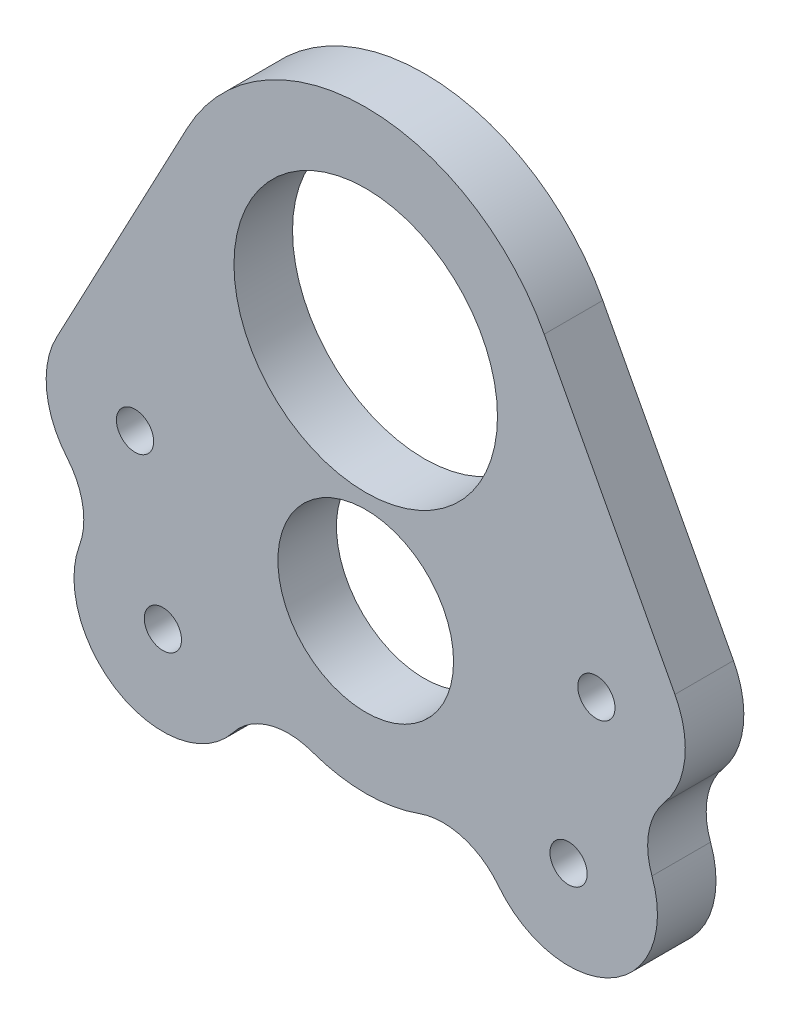
ISO-10303-21;
HEADER;
FILE_DESCRIPTION(('STEP AP214'),'2;1');
FILE_NAME('part.step','',(''),(''),'','','');
FILE_SCHEMA(('AUTOMOTIVE_DESIGN { 1 0 10303 214 1 1 1 1 }'));
ENDSEC;
DATA;
#1=APPLICATION_CONTEXT('core data for automotive mechanical design processes');
#2=APPLICATION_PROTOCOL_DEFINITION('international standard','automotive_design',2000,#1);
#3=PRODUCT_CONTEXT('',#1,'mechanical');
#4=PRODUCT('Part','Part','',(#3));
#5=PRODUCT_RELATED_PRODUCT_CATEGORY('part','',(#4));
#6=PRODUCT_DEFINITION_FORMATION('','',#4);
#7=PRODUCT_DEFINITION_CONTEXT('part definition',#1,'design');
#8=PRODUCT_DEFINITION('design','',#6,#7);
#9=PRODUCT_DEFINITION_SHAPE('','',#8);
#10=(LENGTH_UNIT() NAMED_UNIT(*) SI_UNIT(.MILLI.,.METRE.));
#11=(NAMED_UNIT(*) PLANE_ANGLE_UNIT() SI_UNIT($,.RADIAN.));
#12=(NAMED_UNIT(*) SI_UNIT($,.STERADIAN.) SOLID_ANGLE_UNIT());
#13=UNCERTAINTY_MEASURE_WITH_UNIT(LENGTH_MEASURE(1.E-05),#10,'distance_accuracy_value','');
#14=(GEOMETRIC_REPRESENTATION_CONTEXT(3) GLOBAL_UNCERTAINTY_ASSIGNED_CONTEXT((#13)) GLOBAL_UNIT_ASSIGNED_CONTEXT((#10,
#11,#12)) REPRESENTATION_CONTEXT('',''));
#15=CARTESIAN_POINT('',(0.,0.,0.));
#16=DIRECTION('',(0.,0.,1.));
#17=DIRECTION('',(1.,0.,0.));
#18=AXIS2_PLACEMENT_3D('',#15,#16,#17);
#19=CARTESIAN_POINT('',(25.0141169265101,4.41066371274003,6.35));
#20=DIRECTION('',(0.,0.,1.));
#21=DIRECTION('',(1.,0.,0.));
#22=AXIS2_PLACEMENT_3D('',#19,#20,#21);
#23=PLANE('',#22);
#24=CARTESIAN_POINT('',(-21.9970452561247,-12.7,6.35));
#25=DIRECTION('',(0.,0.,1.));
#26=DIRECTION('',(1.,0.,0.));
#27=AXIS2_PLACEMENT_3D('',#24,#25,#26);
#28=CIRCLE('',#27,2.0193);
#29=CARTESIAN_POINT('',(-19.9777452561247,-12.7,6.35));
#30=VERTEX_POINT('',#29);
#31=EDGE_CURVE('E298',#30,#30,#28,.T.);
#32=ORIENTED_EDGE('',*,*,#31,.F.);
#33=EDGE_LOOP('',(#32));
#34=FACE_BOUND('',#33,.T.);
#35=CARTESIAN_POINT('',(25.0141169265101,4.41066371274003,6.35));
#36=DIRECTION('',(0.,0.,1.));
#37=DIRECTION('',(1.,0.,0.));
#38=AXIS2_PLACEMENT_3D('',#35,#36,#37);
#39=CIRCLE('',#38,2.0193);
#40=CARTESIAN_POINT('',(27.0334169265101,4.41066371274003,6.35));
#41=VERTEX_POINT('',#40);
#42=EDGE_CURVE('E310',#41,#41,#39,.T.);
#43=ORIENTED_EDGE('',*,*,#42,.F.);
#44=EDGE_LOOP('',(#43));
#45=FACE_BOUND('',#44,.T.);
#46=CARTESIAN_POINT('',(0.,25.4,6.35));
#47=DIRECTION('',(0.,0.,1.));
#48=DIRECTION('',(1.,0.,0.));
#49=AXIS2_PLACEMENT_3D('',#46,#47,#48);
#50=CIRCLE('',#49,14.2875);
#51=CARTESIAN_POINT('',(14.2875,25.4,6.35));
#52=VERTEX_POINT('',#51);
#53=EDGE_CURVE('E157',#52,#52,#50,.T.);
#54=ORIENTED_EDGE('',*,*,#53,.F.);
#55=EDGE_LOOP('',(#54));
#56=FACE_BOUND('',#55,.T.);
#57=CARTESIAN_POINT('',(25.0141169265101,4.41066371274003,6.35));
#58=DIRECTION('',(0.,0.,1.));
#59=DIRECTION('',(1.,0.,0.));
#60=AXIS2_PLACEMENT_3D('',#57,#58,#59);
#61=CIRCLE('',#60,9.6393);
#62=CARTESIAN_POINT('',(32.3742647228758,-1.81383055632732,6.35));
#63=VERTEX_POINT('',#62);
#64=CARTESIAN_POINT('',(33.5304812704021,8.92593146250688,6.35));
#65=VERTEX_POINT('',#64);
#66=EDGE_CURVE('E176',#63,#65,#61,.T.);
#67=ORIENTED_EDGE('',*,*,#66,.T.);
#68=DIRECTION('',(-0.468422784825336,0.883504439522789,0.));
#69=VECTOR('',#68,1.);
#70=CARTESIAN_POINT('',(33.5304812704021,8.92593146250688,6.35));
#71=LINE('',#70,#69);
#72=CARTESIAN_POINT('',(19.3553735088455,35.6619721585611,6.35));
#73=VERTEX_POINT('',#72);
#74=EDGE_CURVE('E104',#65,#73,#71,.T.);
#75=ORIENTED_EDGE('',*,*,#74,.T.);
#76=CARTESIAN_POINT('',(0.,25.4,6.35));
#77=DIRECTION('',(0.,0.,1.));
#78=DIRECTION('',(1.,0.,0.));
#79=AXIS2_PLACEMENT_3D('',#76,#77,#78);
#80=CIRCLE('',#79,21.9075);
#81=CARTESIAN_POINT('',(-19.3553735088455,35.6619721585611,6.35));
#82=VERTEX_POINT('',#81);
#83=EDGE_CURVE('E203',#73,#82,#80,.T.);
#84=ORIENTED_EDGE('',*,*,#83,.T.);
#85=DIRECTION('',(-0.468422784825336,-0.883504439522789,0.));
#86=VECTOR('',#85,1.);
#87=CARTESIAN_POINT('',(-33.5304812704021,8.92593146250688,6.35));
#88=LINE('',#87,#86);
#89=CARTESIAN_POINT('',(-33.5304812704021,8.92593146250688,6.35));
#90=VERTEX_POINT('',#89);
#91=EDGE_CURVE('E222',#82,#90,#88,.T.);
#92=ORIENTED_EDGE('',*,*,#91,.T.);
#93=CARTESIAN_POINT('',(-25.0141169265101,4.41066371274002,6.35));
#94=DIRECTION('',(0.,0.,1.));
#95=DIRECTION('',(1.,0.,0.));
#96=AXIS2_PLACEMENT_3D('',#93,#94,#95);
#97=CIRCLE('',#96,9.63930000000001);
#98=CARTESIAN_POINT('',(-32.3742647228758,-1.81383055632735,6.35));
#99=VERTEX_POINT('',#98);
#100=EDGE_CURVE('E219',#90,#99,#97,.T.);
#101=ORIENTED_EDGE('',*,*,#100,.T.);
#102=CARTESIAN_POINT('',(-38.1925633761294,-6.73437938562962,6.35));
#103=DIRECTION('',(0.,0.,-1.));
#104=DIRECTION('',(1.,0.,0.));
#105=AXIS2_PLACEMENT_3D('',#102,#103,#104);
#106=CIRCLE('',#105,7.62);
#107=CARTESIAN_POINT('',(-31.0422242502995,-9.36820747144436,6.35));
#108=VERTEX_POINT('',#107);
#109=EDGE_CURVE('E221',#99,#108,#106,.T.);
#110=ORIENTED_EDGE('',*,*,#109,.T.);
#111=CARTESIAN_POINT('',(-21.9970452561247,-12.7,6.35));
#112=DIRECTION('',(0.,0.,1.));
#113=DIRECTION('',(1.,0.,0.));
#114=AXIS2_PLACEMENT_3D('',#111,#112,#113);
#115=CIRCLE('',#114,9.63930000000001);
#116=CARTESIAN_POINT('',(-14.3917371610649,-18.6224482496024,6.35));
#117=VERTEX_POINT('',#116);
#118=EDGE_CURVE('E224',#108,#117,#115,.T.);
#119=ORIENTED_EDGE('',*,*,#118,.T.);
#120=CARTESIAN_POINT('',(-8.37963590014811,-23.3042255220153,6.35));
#121=DIRECTION('',(0.,0.,-1.));
#122=DIRECTION('',(-1.,0.,0.));
#123=AXIS2_PLACEMENT_3D('',#120,#121,#122);
#124=CIRCLE('',#123,7.62);
#125=CARTESIAN_POINT('',(-5.80128639241023,-16.1336945921644,6.35));
#126=VERTEX_POINT('',#125);
#127=EDGE_CURVE('E230',#117,#126,#124,.T.);
#128=ORIENTED_EDGE('',*,*,#127,.T.);
#129=CARTESIAN_POINT('',(0.,0.,6.35));
#130=DIRECTION('',(0.,0.,1.));
#131=DIRECTION('',(1.,0.,0.));
#132=AXIS2_PLACEMENT_3D('',#129,#130,#131);
#133=CIRCLE('',#132,17.145);
#134=CARTESIAN_POINT('',(5.80128639241024,-16.1336945921644,6.35));
#135=VERTEX_POINT('',#134);
#136=EDGE_CURVE('E135',#126,#135,#133,.T.);
#137=ORIENTED_EDGE('',*,*,#136,.T.);
#138=CARTESIAN_POINT('',(8.37963590014812,-23.3042255220153,6.35));
#139=DIRECTION('',(0.,0.,-1.));
#140=DIRECTION('',(1.,0.,0.));
#141=AXIS2_PLACEMENT_3D('',#138,#139,#140);
#142=CIRCLE('',#141,7.62);
#143=CARTESIAN_POINT('',(14.391737161065,-18.6224482496023,6.35));
#144=VERTEX_POINT('',#143);
#145=EDGE_CURVE('E129',#135,#144,#142,.T.);
#146=ORIENTED_EDGE('',*,*,#145,.T.);
#147=CARTESIAN_POINT('',(21.9970452561247,-12.7,6.35));
#148=DIRECTION('',(0.,0.,1.));
#149=DIRECTION('',(1.,0.,0.));
#150=AXIS2_PLACEMENT_3D('',#147,#148,#149);
#151=CIRCLE('',#150,9.6393);
#152=CARTESIAN_POINT('',(31.0422242502995,-9.36820747144433,6.35));
#153=VERTEX_POINT('',#152);
#154=EDGE_CURVE('E133',#144,#153,#151,.T.);
#155=ORIENTED_EDGE('',*,*,#154,.T.);
#156=CARTESIAN_POINT('',(38.1925633761294,-6.73437938562958,6.35));
#157=DIRECTION('',(0.,0.,-1.));
#158=DIRECTION('',(1.,0.,0.));
#159=AXIS2_PLACEMENT_3D('',#156,#157,#158);
#160=CIRCLE('',#159,7.62);
#161=EDGE_CURVE('E49',#153,#63,#160,.T.);
#162=ORIENTED_EDGE('',*,*,#161,.T.);
#163=EDGE_LOOP('',(#67,#75,#84,#92,#101,#110,#119,#128,#137,#146,#155,#162));
#164=FACE_BOUND('',#163,.T.);
#165=CARTESIAN_POINT('',(0.,0.,6.35));
#166=DIRECTION('',(0.,0.,1.));
#167=DIRECTION('',(1.,0.,0.));
#168=AXIS2_PLACEMENT_3D('',#165,#166,#167);
#169=CIRCLE('',#168,9.525);
#170=CARTESIAN_POINT('',(9.525,0.,6.35));
#171=VERTEX_POINT('',#170);
#172=EDGE_CURVE('E316',#171,#171,#169,.T.);
#173=ORIENTED_EDGE('',*,*,#172,.F.);
#174=EDGE_LOOP('',(#173));
#175=FACE_BOUND('',#174,.T.);
#176=CARTESIAN_POINT('',(21.9970452561247,-12.7,6.35));
#177=DIRECTION('',(0.,0.,1.));
#178=DIRECTION('',(1.,0.,0.));
#179=AXIS2_PLACEMENT_3D('',#176,#177,#178);
#180=CIRCLE('',#179,2.0193);
#181=CARTESIAN_POINT('',(24.0163452561247,-12.7,6.35));
#182=VERTEX_POINT('',#181);
#183=EDGE_CURVE('E304',#182,#182,#180,.T.);
#184=ORIENTED_EDGE('',*,*,#183,.F.);
#185=EDGE_LOOP('',(#184));
#186=FACE_BOUND('',#185,.T.);
#187=CARTESIAN_POINT('',(-25.0141169265101,4.41066371274002,6.35));
#188=DIRECTION('',(0.,0.,1.));
#189=DIRECTION('',(1.,0.,0.));
#190=AXIS2_PLACEMENT_3D('',#187,#188,#189);
#191=CIRCLE('',#190,2.0193);
#192=CARTESIAN_POINT('',(-22.9948169265101,4.41066371274002,6.35));
#193=VERTEX_POINT('',#192);
#194=EDGE_CURVE('E289',#193,#193,#191,.T.);
#195=ORIENTED_EDGE('',*,*,#194,.F.);
#196=EDGE_LOOP('',(#195));
#197=FACE_BOUND('',#196,.T.);
#198=ADVANCED_FACE('F32',(#34,#45,#56,#164,#175,#186,#197),#23,.T.);
#199=CARTESIAN_POINT('',(25.0141169265101,4.41066371274003,0.));
#200=DIRECTION('',(0.,0.,1.));
#201=DIRECTION('',(1.,0.,0.));
#202=AXIS2_PLACEMENT_3D('',#199,#200,#201);
#203=PLANE('',#202);
#204=CARTESIAN_POINT('',(25.0141169265101,4.41066371274003,0.));
#205=DIRECTION('',(0.,0.,1.));
#206=DIRECTION('',(1.,0.,0.));
#207=AXIS2_PLACEMENT_3D('',#204,#205,#206);
#208=CIRCLE('',#207,9.6393);
#209=CARTESIAN_POINT('',(32.3742647228758,-1.81383055632732,0.));
#210=VERTEX_POINT('',#209);
#211=CARTESIAN_POINT('',(33.5304812704021,8.92593146250688,0.));
#212=VERTEX_POINT('',#211);
#213=EDGE_CURVE('E153',#210,#212,#208,.T.);
#214=ORIENTED_EDGE('',*,*,#213,.F.);
#215=CARTESIAN_POINT('',(38.1925633761294,-6.73437938562958,0.));
#216=DIRECTION('',(0.,0.,-1.));
#217=DIRECTION('',(1.,0.,0.));
#218=AXIS2_PLACEMENT_3D('',#215,#216,#217);
#219=CIRCLE('',#218,7.62);
#220=CARTESIAN_POINT('',(31.0422242502995,-9.36820747144433,0.));
#221=VERTEX_POINT('',#220);
#222=EDGE_CURVE('E96',#221,#210,#219,.T.);
#223=ORIENTED_EDGE('',*,*,#222,.F.);
#224=CARTESIAN_POINT('',(21.9970452561247,-12.7,0.));
#225=DIRECTION('',(0.,0.,1.));
#226=DIRECTION('',(1.,0.,0.));
#227=AXIS2_PLACEMENT_3D('',#224,#225,#226);
#228=CIRCLE('',#227,9.6393);
#229=CARTESIAN_POINT('',(14.391737161065,-18.6224482496023,0.));
#230=VERTEX_POINT('',#229);
#231=EDGE_CURVE('E90',#230,#221,#228,.T.);
#232=ORIENTED_EDGE('',*,*,#231,.F.);
#233=CARTESIAN_POINT('',(8.37963590014812,-23.3042255220153,0.));
#234=DIRECTION('',(0.,0.,-1.));
#235=DIRECTION('',(1.,0.,0.));
#236=AXIS2_PLACEMENT_3D('',#233,#234,#235);
#237=CIRCLE('',#236,7.62);
#238=CARTESIAN_POINT('',(5.80128639241024,-16.1336945921644,0.));
#239=VERTEX_POINT('',#238);
#240=EDGE_CURVE('E143',#239,#230,#237,.T.);
#241=ORIENTED_EDGE('',*,*,#240,.F.);
#242=CARTESIAN_POINT('',(0.,0.,0.));
#243=DIRECTION('',(0.,0.,1.));
#244=DIRECTION('',(1.,0.,0.));
#245=AXIS2_PLACEMENT_3D('',#242,#243,#244);
#246=CIRCLE('',#245,17.145);
#247=CARTESIAN_POINT('',(-5.80128639241023,-16.1336945921644,0.));
#248=VERTEX_POINT('',#247);
#249=EDGE_CURVE('E171',#248,#239,#246,.T.);
#250=ORIENTED_EDGE('',*,*,#249,.F.);
#251=CARTESIAN_POINT('',(-8.37963590014811,-23.3042255220153,0.));
#252=DIRECTION('',(0.,0.,-1.));
#253=DIRECTION('',(-1.,0.,0.));
#254=AXIS2_PLACEMENT_3D('',#251,#252,#253);
#255=CIRCLE('',#254,7.62);
#256=CARTESIAN_POINT('',(-14.3917371610649,-18.6224482496024,0.));
#257=VERTEX_POINT('',#256);
#258=EDGE_CURVE('E169',#257,#248,#255,.T.);
#259=ORIENTED_EDGE('',*,*,#258,.F.);
#260=CARTESIAN_POINT('',(-21.9970452561247,-12.7,0.));
#261=DIRECTION('',(0.,0.,1.));
#262=DIRECTION('',(1.,0.,0.));
#263=AXIS2_PLACEMENT_3D('',#260,#261,#262);
#264=CIRCLE('',#263,9.63930000000001);
#265=CARTESIAN_POINT('',(-31.0422242502995,-9.36820747144436,0.));
#266=VERTEX_POINT('',#265);
#267=EDGE_CURVE('E167',#266,#257,#264,.T.);
#268=ORIENTED_EDGE('',*,*,#267,.F.);
#269=CARTESIAN_POINT('',(-38.1925633761294,-6.73437938562962,0.));
#270=DIRECTION('',(0.,0.,-1.));
#271=DIRECTION('',(1.,0.,0.));
#272=AXIS2_PLACEMENT_3D('',#269,#270,#271);
#273=CIRCLE('',#272,7.62);
#274=CARTESIAN_POINT('',(-32.3742647228758,-1.81383055632735,0.));
#275=VERTEX_POINT('',#274);
#276=EDGE_CURVE('E165',#275,#266,#273,.T.);
#277=ORIENTED_EDGE('',*,*,#276,.F.);
#278=CARTESIAN_POINT('',(-25.0141169265101,4.41066371274002,0.));
#279=DIRECTION('',(0.,0.,1.));
#280=DIRECTION('',(1.,0.,0.));
#281=AXIS2_PLACEMENT_3D('',#278,#279,#280);
#282=CIRCLE('',#281,9.63930000000001);
#283=CARTESIAN_POINT('',(-33.5304812704021,8.92593146250688,0.));
#284=VERTEX_POINT('',#283);
#285=EDGE_CURVE('E163',#284,#275,#282,.T.);
#286=ORIENTED_EDGE('',*,*,#285,.F.);
#287=DIRECTION('',(-0.468422784825336,-0.883504439522789,0.));
#288=VECTOR('',#287,1.);
#289=CARTESIAN_POINT('',(-33.5304812704021,8.92593146250688,0.));
#290=LINE('',#289,#288);
#291=CARTESIAN_POINT('',(-19.3553735088455,35.6619721585611,0.));
#292=VERTEX_POINT('',#291);
#293=EDGE_CURVE('E161',#292,#284,#290,.T.);
#294=ORIENTED_EDGE('',*,*,#293,.F.);
#295=CARTESIAN_POINT('',(0.,25.4,0.));
#296=DIRECTION('',(0.,0.,1.));
#297=DIRECTION('',(1.,0.,0.));
#298=AXIS2_PLACEMENT_3D('',#295,#296,#297);
#299=CIRCLE('',#298,21.9075);
#300=CARTESIAN_POINT('',(19.3553735088455,35.6619721585611,0.));
#301=VERTEX_POINT('',#300);
#302=EDGE_CURVE('E159',#301,#292,#299,.T.);
#303=ORIENTED_EDGE('',*,*,#302,.F.);
#304=DIRECTION('',(-0.468422784825336,0.883504439522789,0.));
#305=VECTOR('',#304,1.);
#306=CARTESIAN_POINT('',(33.5304812704021,8.92593146250688,0.));
#307=LINE('',#306,#305);
#308=EDGE_CURVE('E156',#212,#301,#307,.T.);
#309=ORIENTED_EDGE('',*,*,#308,.F.);
#310=EDGE_LOOP('',(#214,#223,#232,#241,#250,#259,#268,#277,#286,#294,#303,#309));
#311=FACE_BOUND('',#310,.T.);
#312=CARTESIAN_POINT('',(0.,25.4,0.));
#313=DIRECTION('',(0.,0.,1.));
#314=DIRECTION('',(1.,0.,0.));
#315=AXIS2_PLACEMENT_3D('',#312,#313,#314);
#316=CIRCLE('',#315,14.2875);
#317=CARTESIAN_POINT('',(14.2875,25.4,0.));
#318=VERTEX_POINT('',#317);
#319=EDGE_CURVE('E319',#318,#318,#316,.T.);
#320=ORIENTED_EDGE('',*,*,#319,.T.);
#321=EDGE_LOOP('',(#320));
#322=FACE_BOUND('',#321,.T.);
#323=CARTESIAN_POINT('',(0.,0.,0.));
#324=DIRECTION('',(0.,0.,1.));
#325=DIRECTION('',(1.,0.,0.));
#326=AXIS2_PLACEMENT_3D('',#323,#324,#325);
#327=CIRCLE('',#326,9.525);
#328=CARTESIAN_POINT('',(9.525,0.,0.));
#329=VERTEX_POINT('',#328);
#330=EDGE_CURVE('E313',#329,#329,#327,.T.);
#331=ORIENTED_EDGE('',*,*,#330,.T.);
#332=EDGE_LOOP('',(#331));
#333=FACE_BOUND('',#332,.T.);
#334=CARTESIAN_POINT('',(25.0141169265101,4.41066371274003,0.));
#335=DIRECTION('',(0.,0.,1.));
#336=DIRECTION('',(1.,0.,0.));
#337=AXIS2_PLACEMENT_3D('',#334,#335,#336);
#338=CIRCLE('',#337,2.0193);
#339=CARTESIAN_POINT('',(27.0334169265101,4.41066371274003,0.));
#340=VERTEX_POINT('',#339);
#341=EDGE_CURVE('E307',#340,#340,#338,.T.);
#342=ORIENTED_EDGE('',*,*,#341,.T.);
#343=EDGE_LOOP('',(#342));
#344=FACE_BOUND('',#343,.T.);
#345=CARTESIAN_POINT('',(21.9970452561247,-12.7,0.));
#346=DIRECTION('',(0.,0.,1.));
#347=DIRECTION('',(1.,0.,0.));
#348=AXIS2_PLACEMENT_3D('',#345,#346,#347);
#349=CIRCLE('',#348,2.0193);
#350=CARTESIAN_POINT('',(24.0163452561247,-12.7,0.));
#351=VERTEX_POINT('',#350);
#352=EDGE_CURVE('E301',#351,#351,#349,.T.);
#353=ORIENTED_EDGE('',*,*,#352,.T.);
#354=EDGE_LOOP('',(#353));
#355=FACE_BOUND('',#354,.T.);
#356=CARTESIAN_POINT('',(-21.9970452561247,-12.7,0.));
#357=DIRECTION('',(0.,0.,1.));
#358=DIRECTION('',(1.,0.,0.));
#359=AXIS2_PLACEMENT_3D('',#356,#357,#358);
#360=CIRCLE('',#359,2.0193);
#361=CARTESIAN_POINT('',(-19.9777452561247,-12.7,0.));
#362=VERTEX_POINT('',#361);
#363=EDGE_CURVE('E295',#362,#362,#360,.T.);
#364=ORIENTED_EDGE('',*,*,#363,.T.);
#365=EDGE_LOOP('',(#364));
#366=FACE_BOUND('',#365,.T.);
#367=CARTESIAN_POINT('',(-25.0141169265101,4.41066371274002,0.));
#368=DIRECTION('',(0.,0.,1.));
#369=DIRECTION('',(1.,0.,0.));
#370=AXIS2_PLACEMENT_3D('',#367,#368,#369);
#371=CIRCLE('',#370,2.0193);
#372=CARTESIAN_POINT('',(-22.9948169265101,4.41066371274002,0.));
#373=VERTEX_POINT('',#372);
#374=EDGE_CURVE('E292',#373,#373,#371,.T.);
#375=ORIENTED_EDGE('',*,*,#374,.T.);
#376=EDGE_LOOP('',(#375));
#377=FACE_BOUND('',#376,.T.);
#378=ADVANCED_FACE('F207',(#311,#322,#333,#344,#355,#366,#377),#203,.F.);
#379=CARTESIAN_POINT('',(25.0141169265101,4.41066371274003,6.35));
#380=DIRECTION('',(0.,0.,-1.));
#381=DIRECTION('',(-1.,0.,0.));
#382=AXIS2_PLACEMENT_3D('',#379,#380,#381);
#383=CYLINDRICAL_SURFACE('',#382,9.6393);
#384=ORIENTED_EDGE('',*,*,#213,.T.);
#385=DIRECTION('',(0.,0.,-1.));
#386=VECTOR('',#385,1.);
#387=CARTESIAN_POINT('',(33.5304812704021,8.92593146250688,6.35));
#388=LINE('',#387,#386);
#389=EDGE_CURVE('E11',#65,#212,#388,.T.);
#390=ORIENTED_EDGE('',*,*,#389,.F.);
#391=ORIENTED_EDGE('',*,*,#66,.F.);
#392=DIRECTION('',(0.,0.,-1.));
#393=VECTOR('',#392,1.);
#394=CARTESIAN_POINT('',(32.3742647228758,-1.81383055632732,6.35));
#395=LINE('',#394,#393);
#396=EDGE_CURVE('E149',#63,#210,#395,.T.);
#397=ORIENTED_EDGE('',*,*,#396,.T.);
#398=EDGE_LOOP('',(#384,#390,#391,#397));
#399=FACE_BOUND('',#398,.T.);
#400=ADVANCED_FACE('F34',(#399),#383,.T.);
#401=CARTESIAN_POINT('',(33.5304812704021,8.92593146250688,6.35));
#402=DIRECTION('',(-0.883504439522789,-0.468422784825336,0.));
#403=DIRECTION('',(0.468422784825336,-0.883504439522789,0.));
#404=AXIS2_PLACEMENT_3D('',#401,#402,#403);
#405=PLANE('',#404);
#406=ORIENTED_EDGE('',*,*,#308,.T.);
#407=DIRECTION('',(0.,0.,-1.));
#408=VECTOR('',#407,1.);
#409=CARTESIAN_POINT('',(19.3553735088455,35.6619721585611,6.35));
#410=LINE('',#409,#408);
#411=EDGE_CURVE('E41',#73,#301,#410,.T.);
#412=ORIENTED_EDGE('',*,*,#411,.F.);
#413=ORIENTED_EDGE('',*,*,#74,.F.);
#414=ORIENTED_EDGE('',*,*,#389,.T.);
#415=EDGE_LOOP('',(#406,#412,#413,#414));
#416=FACE_BOUND('',#415,.T.);
#417=ADVANCED_FACE('F447',(#416),#405,.F.);
#418=CARTESIAN_POINT('',(0.,25.4,6.35));
#419=DIRECTION('',(0.,0.,-1.));
#420=DIRECTION('',(-1.,0.,0.));
#421=AXIS2_PLACEMENT_3D('',#418,#419,#420);
#422=CYLINDRICAL_SURFACE('',#421,21.9075);
#423=ORIENTED_EDGE('',*,*,#302,.T.);
#424=DIRECTION('',(0.,0.,-1.));
#425=VECTOR('',#424,1.);
#426=CARTESIAN_POINT('',(-19.3553735088455,35.6619721585611,6.35));
#427=LINE('',#426,#425);
#428=EDGE_CURVE('E195',#82,#292,#427,.T.);
#429=ORIENTED_EDGE('',*,*,#428,.F.);
#430=ORIENTED_EDGE('',*,*,#83,.F.);
#431=ORIENTED_EDGE('',*,*,#411,.T.);
#432=EDGE_LOOP('',(#423,#429,#430,#431));
#433=FACE_BOUND('',#432,.T.);
#434=ADVANCED_FACE('F201',(#433),#422,.T.);
#435=CARTESIAN_POINT('',(-33.5304812704021,8.92593146250688,6.35));
#436=DIRECTION('',(0.883504439522789,-0.468422784825336,0.));
#437=DIRECTION('',(0.468422784825336,0.883504439522789,0.));
#438=AXIS2_PLACEMENT_3D('',#435,#436,#437);
#439=PLANE('',#438);
#440=ORIENTED_EDGE('',*,*,#293,.T.);
#441=DIRECTION('',(0.,0.,-1.));
#442=VECTOR('',#441,1.);
#443=CARTESIAN_POINT('',(-33.5304812704021,8.92593146250688,6.35));
#444=LINE('',#443,#442);
#445=EDGE_CURVE('E192',#90,#284,#444,.T.);
#446=ORIENTED_EDGE('',*,*,#445,.F.);
#447=ORIENTED_EDGE('',*,*,#91,.F.);
#448=ORIENTED_EDGE('',*,*,#428,.T.);
#449=EDGE_LOOP('',(#440,#446,#447,#448));
#450=FACE_BOUND('',#449,.T.);
#451=ADVANCED_FACE('F213',(#450),#439,.F.);
#452=CARTESIAN_POINT('',(-25.0141169265101,4.41066371274002,6.35));
#453=DIRECTION('',(0.,0.,-1.));
#454=DIRECTION('',(-1.,0.,0.));
#455=AXIS2_PLACEMENT_3D('',#452,#453,#454);
#456=CYLINDRICAL_SURFACE('',#455,9.63930000000001);
#457=ORIENTED_EDGE('',*,*,#285,.T.);
#458=DIRECTION('',(0.,0.,-1.));
#459=VECTOR('',#458,1.);
#460=CARTESIAN_POINT('',(-32.3742647228758,-1.81383055632735,6.35));
#461=LINE('',#460,#459);
#462=EDGE_CURVE('E189',#99,#275,#461,.T.);
#463=ORIENTED_EDGE('',*,*,#462,.F.);
#464=ORIENTED_EDGE('',*,*,#100,.F.);
#465=ORIENTED_EDGE('',*,*,#445,.T.);
#466=EDGE_LOOP('',(#457,#463,#464,#465));
#467=FACE_BOUND('',#466,.T.);
#468=ADVANCED_FACE('F217',(#467),#456,.T.);
#469=CARTESIAN_POINT('',(-38.1925633761294,-6.73437938562962,6.35));
#470=DIRECTION('',(0.,0.,-1.));
#471=DIRECTION('',(-1.,0.,0.));
#472=AXIS2_PLACEMENT_3D('',#469,#470,#471);
#473=CYLINDRICAL_SURFACE('',#472,7.62);
#474=ORIENTED_EDGE('',*,*,#276,.T.);
#475=DIRECTION('',(0.,0.,-1.));
#476=VECTOR('',#475,1.);
#477=CARTESIAN_POINT('',(-31.0422242502995,-9.36820747144436,6.35));
#478=LINE('',#477,#476);
#479=EDGE_CURVE('E186',#108,#266,#478,.T.);
#480=ORIENTED_EDGE('',*,*,#479,.F.);
#481=ORIENTED_EDGE('',*,*,#109,.F.);
#482=ORIENTED_EDGE('',*,*,#462,.T.);
#483=EDGE_LOOP('',(#474,#480,#481,#482));
#484=FACE_BOUND('',#483,.T.);
#485=ADVANCED_FACE('F412',(#484),#473,.F.);
#486=CARTESIAN_POINT('',(-21.9970452561247,-12.7,6.35));
#487=DIRECTION('',(0.,0.,-1.));
#488=DIRECTION('',(-1.,0.,0.));
#489=AXIS2_PLACEMENT_3D('',#486,#487,#488);
#490=CYLINDRICAL_SURFACE('',#489,9.63930000000001);
#491=ORIENTED_EDGE('',*,*,#267,.T.);
#492=DIRECTION('',(0.,0.,-1.));
#493=VECTOR('',#492,1.);
#494=CARTESIAN_POINT('',(-14.3917371610649,-18.6224482496024,6.35));
#495=LINE('',#494,#493);
#496=EDGE_CURVE('E183',#117,#257,#495,.T.);
#497=ORIENTED_EDGE('',*,*,#496,.F.);
#498=ORIENTED_EDGE('',*,*,#118,.F.);
#499=ORIENTED_EDGE('',*,*,#479,.T.);
#500=EDGE_LOOP('',(#491,#497,#498,#499));
#501=FACE_BOUND('',#500,.T.);
#502=ADVANCED_FACE('F403',(#501),#490,.T.);
#503=CARTESIAN_POINT('',(-8.37963590014811,-23.3042255220153,6.35));
#504=DIRECTION('',(0.,0.,-1.));
#505=DIRECTION('',(-1.,0.,0.));
#506=AXIS2_PLACEMENT_3D('',#503,#504,#505);
#507=CYLINDRICAL_SURFACE('',#506,7.62);
#508=ORIENTED_EDGE('',*,*,#258,.T.);
#509=DIRECTION('',(0.,0.,-1.));
#510=VECTOR('',#509,1.);
#511=CARTESIAN_POINT('',(-5.80128639241023,-16.1336945921644,6.35));
#512=LINE('',#511,#510);
#513=EDGE_CURVE('E180',#126,#248,#512,.T.);
#514=ORIENTED_EDGE('',*,*,#513,.F.);
#515=ORIENTED_EDGE('',*,*,#127,.F.);
#516=ORIENTED_EDGE('',*,*,#496,.T.);
#517=EDGE_LOOP('',(#508,#514,#515,#516));
#518=FACE_BOUND('',#517,.T.);
#519=ADVANCED_FACE('F236',(#518),#507,.F.);
#520=CARTESIAN_POINT('',(0.,0.,6.35));
#521=DIRECTION('',(0.,0.,-1.));
#522=DIRECTION('',(-1.,0.,0.));
#523=AXIS2_PLACEMENT_3D('',#520,#521,#522);
#524=CYLINDRICAL_SURFACE('',#523,17.145);
#525=ORIENTED_EDGE('',*,*,#249,.T.);
#526=DIRECTION('',(0.,0.,-1.));
#527=VECTOR('',#526,1.);
#528=CARTESIAN_POINT('',(5.80128639241024,-16.1336945921644,6.35));
#529=LINE('',#528,#527);
#530=EDGE_CURVE('E144',#135,#239,#529,.T.);
#531=ORIENTED_EDGE('',*,*,#530,.F.);
#532=ORIENTED_EDGE('',*,*,#136,.F.);
#533=ORIENTED_EDGE('',*,*,#513,.T.);
#534=EDGE_LOOP('',(#525,#531,#532,#533));
#535=FACE_BOUND('',#534,.T.);
#536=ADVANCED_FACE('F240',(#535),#524,.T.);
#537=CARTESIAN_POINT('',(8.37963590014812,-23.3042255220153,6.35));
#538=DIRECTION('',(0.,0.,-1.));
#539=DIRECTION('',(-1.,0.,0.));
#540=AXIS2_PLACEMENT_3D('',#537,#538,#539);
#541=CYLINDRICAL_SURFACE('',#540,7.62);
#542=ORIENTED_EDGE('',*,*,#240,.T.);
#543=DIRECTION('',(0.,0.,-1.));
#544=VECTOR('',#543,1.);
#545=CARTESIAN_POINT('',(14.391737161065,-18.6224482496023,6.35));
#546=LINE('',#545,#544);
#547=EDGE_CURVE('E140',#144,#230,#546,.T.);
#548=ORIENTED_EDGE('',*,*,#547,.F.);
#549=ORIENTED_EDGE('',*,*,#145,.F.);
#550=ORIENTED_EDGE('',*,*,#530,.T.);
#551=EDGE_LOOP('',(#542,#548,#549,#550));
#552=FACE_BOUND('',#551,.T.);
#553=ADVANCED_FACE('F141',(#552),#541,.F.);
#554=CARTESIAN_POINT('',(21.9970452561247,-12.7,6.35));
#555=DIRECTION('',(0.,0.,-1.));
#556=DIRECTION('',(-1.,0.,0.));
#557=AXIS2_PLACEMENT_3D('',#554,#555,#556);
#558=CYLINDRICAL_SURFACE('',#557,9.6393);
#559=ORIENTED_EDGE('',*,*,#231,.T.);
#560=DIRECTION('',(0.,0.,-1.));
#561=VECTOR('',#560,1.);
#562=CARTESIAN_POINT('',(31.0422242502995,-9.36820747144433,6.35));
#563=LINE('',#562,#561);
#564=EDGE_CURVE('E145',#153,#221,#563,.T.);
#565=ORIENTED_EDGE('',*,*,#564,.F.);
#566=ORIENTED_EDGE('',*,*,#154,.F.);
#567=ORIENTED_EDGE('',*,*,#547,.T.);
#568=EDGE_LOOP('',(#559,#565,#566,#567));
#569=FACE_BOUND('',#568,.T.);
#570=ADVANCED_FACE('F147',(#569),#558,.T.);
#571=CARTESIAN_POINT('',(38.1925633761294,-6.73437938562958,6.35));
#572=DIRECTION('',(0.,0.,-1.));
#573=DIRECTION('',(-1.,0.,0.));
#574=AXIS2_PLACEMENT_3D('',#571,#572,#573);
#575=CYLINDRICAL_SURFACE('',#574,7.62);
#576=ORIENTED_EDGE('',*,*,#222,.T.);
#577=ORIENTED_EDGE('',*,*,#396,.F.);
#578=ORIENTED_EDGE('',*,*,#161,.F.);
#579=ORIENTED_EDGE('',*,*,#564,.T.);
#580=EDGE_LOOP('',(#576,#577,#578,#579));
#581=FACE_BOUND('',#580,.T.);
#582=ADVANCED_FACE('F244',(#581),#575,.F.);
#583=CARTESIAN_POINT('',(0.,25.4,6.35));
#584=DIRECTION('',(0.,0.,-1.));
#585=DIRECTION('',(-1.,0.,0.));
#586=AXIS2_PLACEMENT_3D('',#583,#584,#585);
#587=CYLINDRICAL_SURFACE('',#586,14.2875);
#588=ORIENTED_EDGE('',*,*,#53,.T.);
#589=EDGE_LOOP('',(#588));
#590=FACE_BOUND('',#589,.T.);
#591=ORIENTED_EDGE('',*,*,#319,.F.);
#592=EDGE_LOOP('',(#591));
#593=FACE_BOUND('',#592,.T.);
#594=ADVANCED_FACE('F246',(#590,#593),#587,.F.);
#595=CARTESIAN_POINT('',(0.,0.,6.35));
#596=DIRECTION('',(0.,0.,-1.));
#597=DIRECTION('',(-1.,0.,0.));
#598=AXIS2_PLACEMENT_3D('',#595,#596,#597);
#599=CYLINDRICAL_SURFACE('',#598,9.525);
#600=ORIENTED_EDGE('',*,*,#172,.T.);
#601=EDGE_LOOP('',(#600));
#602=FACE_BOUND('',#601,.T.);
#603=ORIENTED_EDGE('',*,*,#330,.F.);
#604=EDGE_LOOP('',(#603));
#605=FACE_BOUND('',#604,.T.);
#606=ADVANCED_FACE('F252',(#602,#605),#599,.F.);
#607=CARTESIAN_POINT('',(25.0141169265101,4.41066371274003,6.35));
#608=DIRECTION('',(0.,0.,-1.));
#609=DIRECTION('',(-1.,0.,0.));
#610=AXIS2_PLACEMENT_3D('',#607,#608,#609);
#611=CYLINDRICAL_SURFACE('',#610,2.0193);
#612=ORIENTED_EDGE('',*,*,#42,.T.);
#613=EDGE_LOOP('',(#612));
#614=FACE_BOUND('',#613,.T.);
#615=ORIENTED_EDGE('',*,*,#341,.F.);
#616=EDGE_LOOP('',(#615));
#617=FACE_BOUND('',#616,.T.);
#618=ADVANCED_FACE('F268',(#614,#617),#611,.F.);
#619=CARTESIAN_POINT('',(21.9970452561247,-12.7,6.35));
#620=DIRECTION('',(0.,0.,-1.));
#621=DIRECTION('',(-1.,0.,0.));
#622=AXIS2_PLACEMENT_3D('',#619,#620,#621);
#623=CYLINDRICAL_SURFACE('',#622,2.0193);
#624=ORIENTED_EDGE('',*,*,#183,.T.);
#625=EDGE_LOOP('',(#624));
#626=FACE_BOUND('',#625,.T.);
#627=ORIENTED_EDGE('',*,*,#352,.F.);
#628=EDGE_LOOP('',(#627));
#629=FACE_BOUND('',#628,.T.);
#630=ADVANCED_FACE('F272',(#626,#629),#623,.F.);
#631=CARTESIAN_POINT('',(-21.9970452561247,-12.7,6.35));
#632=DIRECTION('',(0.,0.,-1.));
#633=DIRECTION('',(-1.,0.,0.));
#634=AXIS2_PLACEMENT_3D('',#631,#632,#633);
#635=CYLINDRICAL_SURFACE('',#634,2.0193);
#636=ORIENTED_EDGE('',*,*,#31,.T.);
#637=EDGE_LOOP('',(#636));
#638=FACE_BOUND('',#637,.T.);
#639=ORIENTED_EDGE('',*,*,#363,.F.);
#640=EDGE_LOOP('',(#639));
#641=FACE_BOUND('',#640,.T.);
#642=ADVANCED_FACE('F276',(#638,#641),#635,.F.);
#643=CARTESIAN_POINT('',(-25.0141169265101,4.41066371274002,6.35));
#644=DIRECTION('',(0.,0.,-1.));
#645=DIRECTION('',(-1.,0.,0.));
#646=AXIS2_PLACEMENT_3D('',#643,#644,#645);
#647=CYLINDRICAL_SURFACE('',#646,2.0193);
#648=ORIENTED_EDGE('',*,*,#194,.T.);
#649=EDGE_LOOP('',(#648));
#650=FACE_BOUND('',#649,.T.);
#651=ORIENTED_EDGE('',*,*,#374,.F.);
#652=EDGE_LOOP('',(#651));
#653=FACE_BOUND('',#652,.T.);
#654=ADVANCED_FACE('F280',(#650,#653),#647,.F.);
#655=CLOSED_SHELL('',(#198,#378,#400,#417,#434,#451,#468,#485,#502,#519,#536,#553,#570,#582,
#594,#606,#618,#630,#642,#654));
#656=MANIFOLD_SOLID_BREP('B2',#655);
#657=ADVANCED_BREP_SHAPE_REPRESENTATION('',(#18,#656),#14);
#658=SHAPE_DEFINITION_REPRESENTATION(#9,#657);
ENDSEC;
END-ISO-10303-21;
